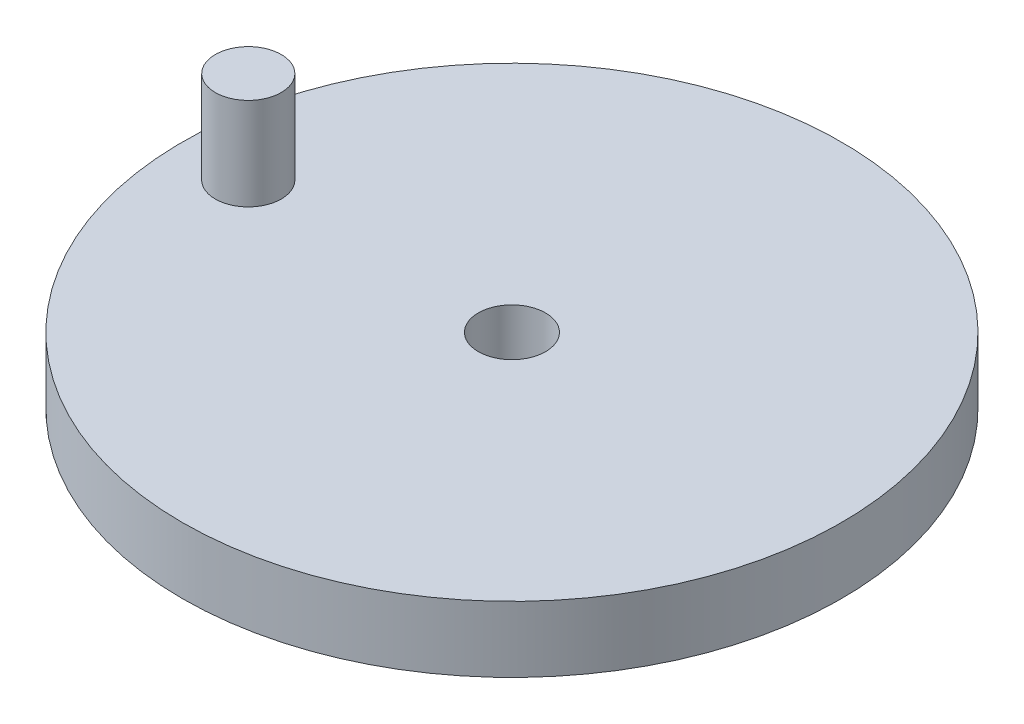
ISO-10303-21;
HEADER;
FILE_DESCRIPTION(('STEP AP214'),'2;1');
FILE_NAME('part.step','',(''),(''),'','','');
FILE_SCHEMA(('AUTOMOTIVE_DESIGN { 1 0 10303 214 1 1 1 1 }'));
ENDSEC;
DATA;
#1=APPLICATION_CONTEXT('core data for automotive mechanical design processes');
#2=APPLICATION_PROTOCOL_DEFINITION('international standard','automotive_design',2000,#1);
#3=PRODUCT_CONTEXT('',#1,'mechanical');
#4=PRODUCT('Part','Part','',(#3));
#5=PRODUCT_RELATED_PRODUCT_CATEGORY('part','',(#4));
#6=PRODUCT_DEFINITION_FORMATION('','',#4);
#7=PRODUCT_DEFINITION_CONTEXT('part definition',#1,'design');
#8=PRODUCT_DEFINITION('design','',#6,#7);
#9=PRODUCT_DEFINITION_SHAPE('','',#8);
#10=(LENGTH_UNIT() NAMED_UNIT(*) SI_UNIT(.MILLI.,.METRE.));
#11=(NAMED_UNIT(*) PLANE_ANGLE_UNIT() SI_UNIT($,.RADIAN.));
#12=(NAMED_UNIT(*) SI_UNIT($,.STERADIAN.) SOLID_ANGLE_UNIT());
#13=UNCERTAINTY_MEASURE_WITH_UNIT(LENGTH_MEASURE(1.E-05),#10,'distance_accuracy_value','');
#14=(GEOMETRIC_REPRESENTATION_CONTEXT(3) GLOBAL_UNCERTAINTY_ASSIGNED_CONTEXT((#13)) GLOBAL_UNIT_ASSIGNED_CONTEXT((#10,
#11,#12)) REPRESENTATION_CONTEXT('',''));
#15=CARTESIAN_POINT('',(0.,0.,0.));
#16=DIRECTION('',(0.,0.,1.));
#17=DIRECTION('',(1.,0.,0.));
#18=AXIS2_PLACEMENT_3D('',#15,#16,#17);
#19=CARTESIAN_POINT('',(0.,5.,0.));
#20=DIRECTION('',(0.,1.,0.));
#21=DIRECTION('',(0.,0.,1.));
#22=AXIS2_PLACEMENT_3D('',#19,#20,#21);
#23=PLANE('',#22);
#24=CARTESIAN_POINT('',(-20.,5.,0.));
#25=DIRECTION('',(0.,1.,0.));
#26=DIRECTION('',(0.,0.,1.));
#27=AXIS2_PLACEMENT_3D('',#24,#25,#26);
#28=CIRCLE('',#27,2.5);
#29=CARTESIAN_POINT('',(-20.,5.,2.5));
#30=VERTEX_POINT('',#29);
#31=EDGE_CURVE('E54',#30,#30,#28,.T.);
#32=ORIENTED_EDGE('',*,*,#31,.F.);
#33=EDGE_LOOP('',(#32));
#34=FACE_BOUND('',#33,.T.);
#35=CARTESIAN_POINT('',(0.,5.,0.));
#36=DIRECTION('',(0.,1.,0.));
#37=DIRECTION('',(0.,0.,1.));
#38=AXIS2_PLACEMENT_3D('',#35,#36,#37);
#39=CIRCLE('',#38,25.);
#40=CARTESIAN_POINT('',(0.,5.,25.));
#41=VERTEX_POINT('',#40);
#42=EDGE_CURVE('E10',#41,#41,#39,.T.);
#43=ORIENTED_EDGE('',*,*,#42,.T.);
#44=EDGE_LOOP('',(#43));
#45=FACE_BOUND('',#44,.T.);
#46=CARTESIAN_POINT('',(0.,5.,0.));
#47=DIRECTION('',(0.,1.,0.));
#48=DIRECTION('',(0.,0.,1.));
#49=AXIS2_PLACEMENT_3D('',#46,#47,#48);
#50=CIRCLE('',#49,2.55);
#51=CARTESIAN_POINT('',(0.,5.,2.55));
#52=VERTEX_POINT('',#51);
#53=EDGE_CURVE('E46',#52,#52,#50,.T.);
#54=ORIENTED_EDGE('',*,*,#53,.F.);
#55=EDGE_LOOP('',(#54));
#56=FACE_BOUND('',#55,.T.);
#57=ADVANCED_FACE('F35',(#34,#45,#56),#23,.T.);
#58=CARTESIAN_POINT('',(0.,0.,0.));
#59=DIRECTION('',(0.,1.,0.));
#60=DIRECTION('',(0.,0.,1.));
#61=AXIS2_PLACEMENT_3D('',#58,#59,#60);
#62=PLANE('',#61);
#63=CARTESIAN_POINT('',(0.,0.,0.));
#64=DIRECTION('',(0.,1.,0.));
#65=DIRECTION('',(0.,0.,1.));
#66=AXIS2_PLACEMENT_3D('',#63,#64,#65);
#67=CIRCLE('',#66,25.);
#68=CARTESIAN_POINT('',(0.,0.,25.));
#69=VERTEX_POINT('',#68);
#70=EDGE_CURVE('E39',#69,#69,#67,.T.);
#71=ORIENTED_EDGE('',*,*,#70,.F.);
#72=EDGE_LOOP('',(#71));
#73=FACE_BOUND('',#72,.T.);
#74=CARTESIAN_POINT('',(0.,0.,0.));
#75=DIRECTION('',(0.,1.,0.));
#76=DIRECTION('',(0.,0.,1.));
#77=AXIS2_PLACEMENT_3D('',#74,#75,#76);
#78=CIRCLE('',#77,2.55);
#79=CARTESIAN_POINT('',(0.,0.,2.55));
#80=VERTEX_POINT('',#79);
#81=EDGE_CURVE('E48',#80,#80,#78,.T.);
#82=ORIENTED_EDGE('',*,*,#81,.T.);
#83=EDGE_LOOP('',(#82));
#84=FACE_BOUND('',#83,.T.);
#85=ADVANCED_FACE('F70',(#73,#84),#62,.F.);
#86=CARTESIAN_POINT('',(0.,5.,0.));
#87=DIRECTION('',(0.,-1.,0.));
#88=DIRECTION('',(0.,0.,-1.));
#89=AXIS2_PLACEMENT_3D('',#86,#87,#88);
#90=CYLINDRICAL_SURFACE('',#89,25.);
#91=ORIENTED_EDGE('',*,*,#42,.F.);
#92=EDGE_LOOP('',(#91));
#93=FACE_BOUND('',#92,.T.);
#94=ORIENTED_EDGE('',*,*,#70,.T.);
#95=EDGE_LOOP('',(#94));
#96=FACE_BOUND('',#95,.T.);
#97=ADVANCED_FACE('F37',(#93,#96),#90,.T.);
#98=CARTESIAN_POINT('',(0.,5.,0.));
#99=DIRECTION('',(0.,-1.,0.));
#100=DIRECTION('',(0.,0.,-1.));
#101=AXIS2_PLACEMENT_3D('',#98,#99,#100);
#102=CYLINDRICAL_SURFACE('',#101,2.55);
#103=ORIENTED_EDGE('',*,*,#53,.T.);
#104=EDGE_LOOP('',(#103));
#105=FACE_BOUND('',#104,.T.);
#106=ORIENTED_EDGE('',*,*,#81,.F.);
#107=EDGE_LOOP('',(#106));
#108=FACE_BOUND('',#107,.T.);
#109=ADVANCED_FACE('F65',(#105,#108),#102,.F.);
#110=CARTESIAN_POINT('',(-20.,12.,0.));
#111=DIRECTION('',(0.,-1.,0.));
#112=DIRECTION('',(0.,0.,-1.));
#113=AXIS2_PLACEMENT_3D('',#110,#111,#112);
#114=CYLINDRICAL_SURFACE('',#113,2.5);
#115=CARTESIAN_POINT('',(-20.,12.,0.));
#116=DIRECTION('',(0.,1.,0.));
#117=DIRECTION('',(0.,0.,1.));
#118=AXIS2_PLACEMENT_3D('',#115,#116,#117);
#119=CIRCLE('',#118,2.5);
#120=CARTESIAN_POINT('',(-20.,12.,2.5));
#121=VERTEX_POINT('',#120);
#122=EDGE_CURVE('E51',#121,#121,#119,.T.);
#123=ORIENTED_EDGE('',*,*,#122,.F.);
#124=EDGE_LOOP('',(#123));
#125=FACE_BOUND('',#124,.T.);
#126=ORIENTED_EDGE('',*,*,#31,.T.);
#127=EDGE_LOOP('',(#126));
#128=FACE_BOUND('',#127,.T.);
#129=ADVANCED_FACE('F62',(#125,#128),#114,.T.);
#130=CARTESIAN_POINT('',(-20.,12.,0.));
#131=DIRECTION('',(0.,1.,0.));
#132=DIRECTION('',(0.,0.,1.));
#133=AXIS2_PLACEMENT_3D('',#130,#131,#132);
#134=PLANE('',#133);
#135=ORIENTED_EDGE('',*,*,#122,.T.);
#136=EDGE_LOOP('',(#135));
#137=FACE_BOUND('',#136,.T.);
#138=ADVANCED_FACE('F60',(#137),#134,.T.);
#139=CLOSED_SHELL('',(#57,#85,#97,#109,#129,#138));
#140=MANIFOLD_SOLID_BREP('B2',#139);
#141=ADVANCED_BREP_SHAPE_REPRESENTATION('',(#18,#140),#14);
#142=SHAPE_DEFINITION_REPRESENTATION(#9,#141);
ENDSEC;
END-ISO-10303-21;
